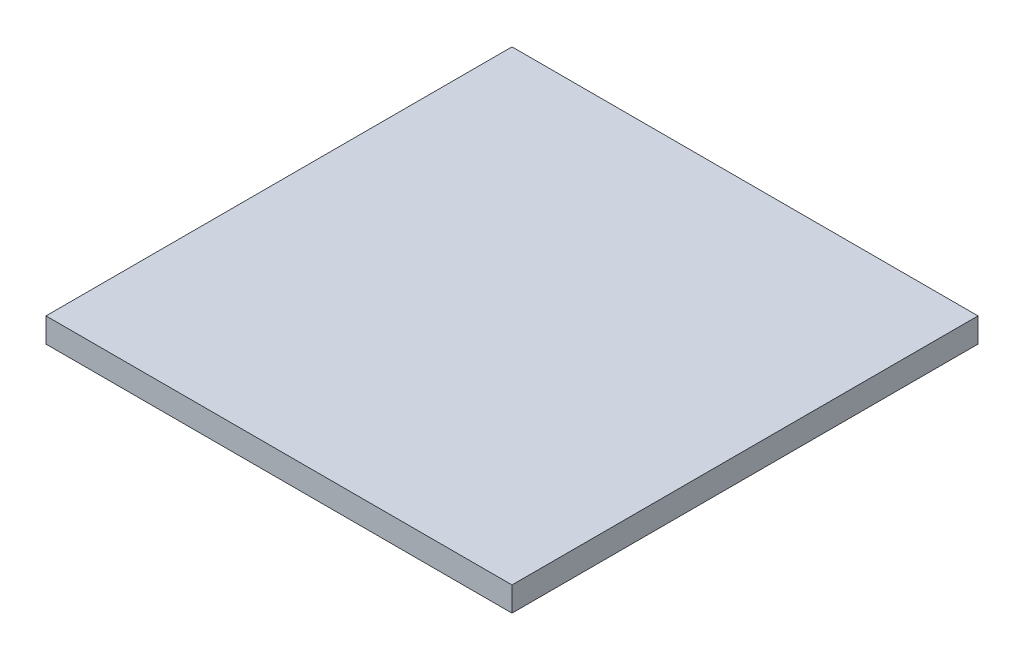
ISO-10303-21;
HEADER;
FILE_DESCRIPTION(('STEP AP214'),'2;1');
FILE_NAME('part.step','',(''),(''),'','','');
FILE_SCHEMA(('AUTOMOTIVE_DESIGN { 1 0 10303 214 1 1 1 1 }'));
ENDSEC;
DATA;
#1=APPLICATION_CONTEXT('core data for automotive mechanical design processes');
#2=APPLICATION_PROTOCOL_DEFINITION('international standard','automotive_design',2000,#1);
#3=PRODUCT_CONTEXT('',#1,'mechanical');
#4=PRODUCT('Part','Part','',(#3));
#5=PRODUCT_RELATED_PRODUCT_CATEGORY('part','',(#4));
#6=PRODUCT_DEFINITION_FORMATION('','',#4);
#7=PRODUCT_DEFINITION_CONTEXT('part definition',#1,'design');
#8=PRODUCT_DEFINITION('design','',#6,#7);
#9=PRODUCT_DEFINITION_SHAPE('','',#8);
#10=(LENGTH_UNIT() NAMED_UNIT(*) SI_UNIT(.MILLI.,.METRE.));
#11=(NAMED_UNIT(*) PLANE_ANGLE_UNIT() SI_UNIT($,.RADIAN.));
#12=(NAMED_UNIT(*) SI_UNIT($,.STERADIAN.) SOLID_ANGLE_UNIT());
#13=UNCERTAINTY_MEASURE_WITH_UNIT(LENGTH_MEASURE(1.E-05),#10,'distance_accuracy_value','');
#14=(GEOMETRIC_REPRESENTATION_CONTEXT(3) GLOBAL_UNCERTAINTY_ASSIGNED_CONTEXT((#13)) GLOBAL_UNIT_ASSIGNED_CONTEXT((#10,
#11,#12)) REPRESENTATION_CONTEXT('',''));
#15=CARTESIAN_POINT('',(0.,0.,0.));
#16=DIRECTION('',(0.,0.,1.));
#17=DIRECTION('',(1.,0.,0.));
#18=AXIS2_PLACEMENT_3D('',#15,#16,#17);
#19=CARTESIAN_POINT('',(400.,1958.,-500.));
#20=DIRECTION('',(-1.,0.,0.));
#21=DIRECTION('',(0.,0.,1.));
#22=AXIS2_PLACEMENT_3D('',#19,#20,#21);
#23=PLANE('',#22);
#24=DIRECTION('',(0.,-1.,0.));
#25=VECTOR('',#24,1.);
#26=CARTESIAN_POINT('',(400.,1958.,-300.));
#27=LINE('',#26,#25);
#28=CARTESIAN_POINT('',(400.,1968.5,-300.));
#29=VERTEX_POINT('',#28);
#30=CARTESIAN_POINT('',(400.,1958.,-300.));
#31=VERTEX_POINT('',#30);
#32=EDGE_CURVE('E103',#29,#31,#27,.T.);
#33=ORIENTED_EDGE('',*,*,#32,.F.);
#34=DIRECTION('',(0.,0.,1.));
#35=VECTOR('',#34,1.);
#36=CARTESIAN_POINT('',(400.,1968.5,-500.));
#37=LINE('',#36,#35);
#38=CARTESIAN_POINT('',(400.,1968.5,-500.));
#39=VERTEX_POINT('',#38);
#40=EDGE_CURVE('E11',#39,#29,#37,.T.);
#41=ORIENTED_EDGE('',*,*,#40,.F.);
#42=DIRECTION('',(0.,-1.,0.));
#43=VECTOR('',#42,1.);
#44=CARTESIAN_POINT('',(400.,1958.,-500.));
#45=LINE('',#44,#43);
#46=CARTESIAN_POINT('',(400.,1958.,-500.));
#47=VERTEX_POINT('',#46);
#48=EDGE_CURVE('E97',#39,#47,#45,.T.);
#49=ORIENTED_EDGE('',*,*,#48,.T.);
#50=DIRECTION('',(0.,0.,1.));
#51=VECTOR('',#50,1.);
#52=CARTESIAN_POINT('',(400.,1958.,-500.));
#53=LINE('',#52,#51);
#54=EDGE_CURVE('E42',#47,#31,#53,.T.);
#55=ORIENTED_EDGE('',*,*,#54,.T.);
#56=EDGE_LOOP('',(#33,#41,#49,#55));
#57=FACE_BOUND('',#56,.T.);
#58=ADVANCED_FACE('F39',(#57),#23,.T.);
#59=CARTESIAN_POINT('',(400.,1968.5,-500.));
#60=DIRECTION('',(0.,1.,0.));
#61=DIRECTION('',(0.,0.,1.));
#62=AXIS2_PLACEMENT_3D('',#59,#60,#61);
#63=PLANE('',#62);
#64=DIRECTION('',(-1.,0.,0.));
#65=VECTOR('',#64,1.);
#66=CARTESIAN_POINT('',(400.,1968.5,-300.));
#67=LINE('',#66,#65);
#68=CARTESIAN_POINT('',(600.,1968.5,-300.));
#69=VERTEX_POINT('',#68);
#70=EDGE_CURVE('E99',#69,#29,#67,.T.);
#71=ORIENTED_EDGE('',*,*,#70,.F.);
#72=DIRECTION('',(0.,0.,1.));
#73=VECTOR('',#72,1.);
#74=CARTESIAN_POINT('',(600.,1968.5,-500.));
#75=LINE('',#74,#73);
#76=CARTESIAN_POINT('',(600.,1968.5,-500.));
#77=VERTEX_POINT('',#76);
#78=EDGE_CURVE('E48',#77,#69,#75,.T.);
#79=ORIENTED_EDGE('',*,*,#78,.F.);
#80=DIRECTION('',(-1.,0.,0.));
#81=VECTOR('',#80,1.);
#82=CARTESIAN_POINT('',(400.,1968.5,-500.));
#83=LINE('',#82,#81);
#84=EDGE_CURVE('E94',#77,#39,#83,.T.);
#85=ORIENTED_EDGE('',*,*,#84,.T.);
#86=ORIENTED_EDGE('',*,*,#40,.T.);
#87=EDGE_LOOP('',(#71,#79,#85,#86));
#88=FACE_BOUND('',#87,.T.);
#89=ADVANCED_FACE('F113',(#88),#63,.T.);
#90=CARTESIAN_POINT('',(600.,1958.,-500.));
#91=DIRECTION('',(1.,0.,0.));
#92=DIRECTION('',(0.,0.,-1.));
#93=AXIS2_PLACEMENT_3D('',#90,#91,#92);
#94=PLANE('',#93);
#95=DIRECTION('',(0.,1.,0.));
#96=VECTOR('',#95,1.);
#97=CARTESIAN_POINT('',(600.,1958.,-300.));
#98=LINE('',#97,#96);
#99=CARTESIAN_POINT('',(600.,1958.,-300.));
#100=VERTEX_POINT('',#99);
#101=EDGE_CURVE('E89',#100,#69,#98,.T.);
#102=ORIENTED_EDGE('',*,*,#101,.F.);
#103=DIRECTION('',(0.,0.,1.));
#104=VECTOR('',#103,1.);
#105=CARTESIAN_POINT('',(600.,1958.,-500.));
#106=LINE('',#105,#104);
#107=CARTESIAN_POINT('',(600.,1958.,-500.));
#108=VERTEX_POINT('',#107);
#109=EDGE_CURVE('E84',#108,#100,#106,.T.);
#110=ORIENTED_EDGE('',*,*,#109,.F.);
#111=DIRECTION('',(0.,1.,0.));
#112=VECTOR('',#111,1.);
#113=CARTESIAN_POINT('',(600.,1958.,-500.));
#114=LINE('',#113,#112);
#115=EDGE_CURVE('E87',#108,#77,#114,.T.);
#116=ORIENTED_EDGE('',*,*,#115,.T.);
#117=ORIENTED_EDGE('',*,*,#78,.T.);
#118=EDGE_LOOP('',(#102,#110,#116,#117));
#119=FACE_BOUND('',#118,.T.);
#120=ADVANCED_FACE('F86',(#119),#94,.T.);
#121=CARTESIAN_POINT('',(400.,1958.,-500.));
#122=DIRECTION('',(0.,-1.,0.));
#123=DIRECTION('',(0.,0.,-1.));
#124=AXIS2_PLACEMENT_3D('',#121,#122,#123);
#125=PLANE('',#124);
#126=DIRECTION('',(1.,0.,0.));
#127=VECTOR('',#126,1.);
#128=CARTESIAN_POINT('',(400.,1958.,-300.));
#129=LINE('',#128,#127);
#130=EDGE_CURVE('E106',#31,#100,#129,.T.);
#131=ORIENTED_EDGE('',*,*,#130,.F.);
#132=ORIENTED_EDGE('',*,*,#54,.F.);
#133=DIRECTION('',(1.,0.,0.));
#134=VECTOR('',#133,1.);
#135=CARTESIAN_POINT('',(400.,1958.,-500.));
#136=LINE('',#135,#134);
#137=EDGE_CURVE('E93',#47,#108,#136,.T.);
#138=ORIENTED_EDGE('',*,*,#137,.T.);
#139=ORIENTED_EDGE('',*,*,#109,.T.);
#140=EDGE_LOOP('',(#131,#132,#138,#139));
#141=FACE_BOUND('',#140,.T.);
#142=ADVANCED_FACE('F96',(#141),#125,.T.);
#143=CARTESIAN_POINT('',(0.,0.,-500.));
#144=DIRECTION('',(0.,0.,-1.));
#145=DIRECTION('',(-1.,0.,0.));
#146=AXIS2_PLACEMENT_3D('',#143,#144,#145);
#147=PLANE('',#146);
#148=ORIENTED_EDGE('',*,*,#48,.F.);
#149=ORIENTED_EDGE('',*,*,#84,.F.);
#150=ORIENTED_EDGE('',*,*,#115,.F.);
#151=ORIENTED_EDGE('',*,*,#137,.F.);
#152=EDGE_LOOP('',(#148,#149,#150,#151));
#153=FACE_BOUND('',#152,.T.);
#154=ADVANCED_FACE('F92',(#153),#147,.T.);
#155=CARTESIAN_POINT('',(0.,0.,-300.));
#156=DIRECTION('',(0.,0.,-1.));
#157=DIRECTION('',(-1.,0.,0.));
#158=AXIS2_PLACEMENT_3D('',#155,#156,#157);
#159=PLANE('',#158);
#160=ORIENTED_EDGE('',*,*,#32,.T.);
#161=ORIENTED_EDGE('',*,*,#130,.T.);
#162=ORIENTED_EDGE('',*,*,#101,.T.);
#163=ORIENTED_EDGE('',*,*,#70,.T.);
#164=EDGE_LOOP('',(#160,#161,#162,#163));
#165=FACE_BOUND('',#164,.T.);
#166=ADVANCED_FACE('F112',(#165),#159,.F.);
#167=CLOSED_SHELL('',(#58,#89,#120,#142,#154,#166));
#168=MANIFOLD_SOLID_BREP('B2',#167);
#169=ADVANCED_BREP_SHAPE_REPRESENTATION('',(#18,#168),#14);
#170=SHAPE_DEFINITION_REPRESENTATION(#9,#169);
ENDSEC;
END-ISO-10303-21;
